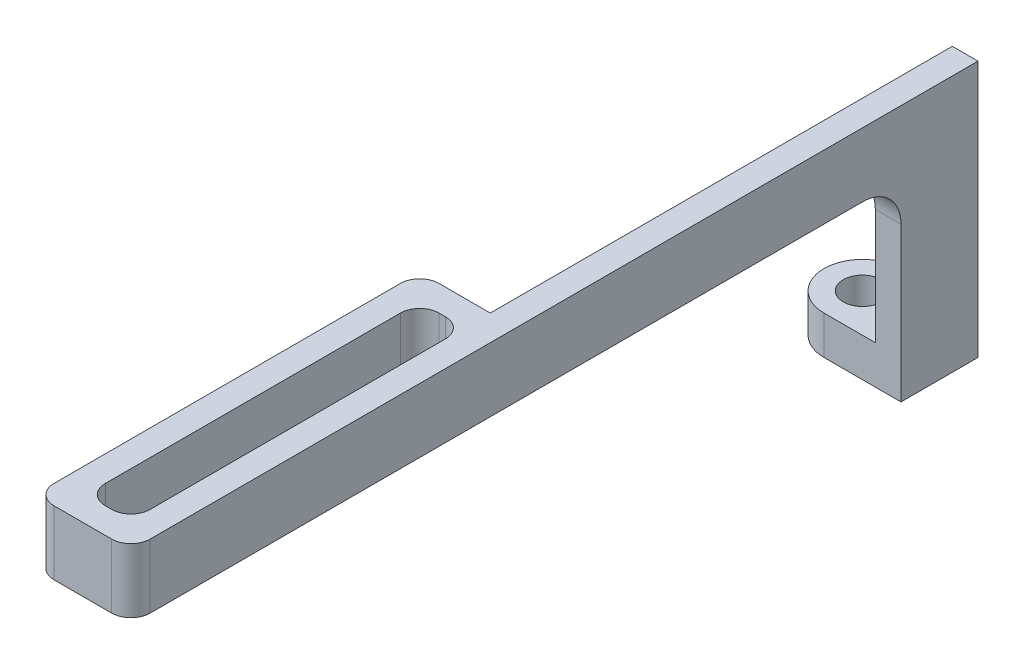
ISO-10303-21;
HEADER;
FILE_DESCRIPTION(('STEP AP214'),'2;1');
FILE_NAME('part.step','',(''),(''),'','','');
FILE_SCHEMA(('AUTOMOTIVE_DESIGN { 1 0 10303 214 1 1 1 1 }'));
ENDSEC;
DATA;
#1=APPLICATION_CONTEXT('core data for automotive mechanical design processes');
#2=APPLICATION_PROTOCOL_DEFINITION('international standard','automotive_design',2000,#1);
#3=PRODUCT_CONTEXT('',#1,'mechanical');
#4=PRODUCT('Part','Part','',(#3));
#5=PRODUCT_RELATED_PRODUCT_CATEGORY('part','',(#4));
#6=PRODUCT_DEFINITION_FORMATION('','',#4);
#7=PRODUCT_DEFINITION_CONTEXT('part definition',#1,'design');
#8=PRODUCT_DEFINITION('design','',#6,#7);
#9=PRODUCT_DEFINITION_SHAPE('','',#8);
#10=(LENGTH_UNIT() NAMED_UNIT(*) SI_UNIT(.MILLI.,.METRE.));
#11=(NAMED_UNIT(*) PLANE_ANGLE_UNIT() SI_UNIT($,.RADIAN.));
#12=(NAMED_UNIT(*) SI_UNIT($,.STERADIAN.) SOLID_ANGLE_UNIT());
#13=UNCERTAINTY_MEASURE_WITH_UNIT(LENGTH_MEASURE(1.E-05),#10,'distance_accuracy_value','');
#14=(GEOMETRIC_REPRESENTATION_CONTEXT(3) GLOBAL_UNCERTAINTY_ASSIGNED_CONTEXT((#13)) GLOBAL_UNIT_ASSIGNED_CONTEXT((#10,
#11,#12)) REPRESENTATION_CONTEXT('',''));
#15=CARTESIAN_POINT('',(0.,0.,0.));
#16=DIRECTION('',(0.,0.,1.));
#17=DIRECTION('',(1.,0.,0.));
#18=AXIS2_PLACEMENT_3D('',#15,#16,#17);
#19=CARTESIAN_POINT('',(0.,3.,0.));
#20=DIRECTION('',(0.,1.,0.));
#21=DIRECTION('',(0.,0.,1.));
#22=AXIS2_PLACEMENT_3D('',#19,#20,#21);
#23=PLANE('',#22);
#24=CARTESIAN_POINT('',(0.,3.,0.));
#25=DIRECTION('',(0.,1.,0.));
#26=DIRECTION('',(0.,0.,1.));
#27=AXIS2_PLACEMENT_3D('',#24,#25,#26);
#28=CIRCLE('',#27,1.5);
#29=CARTESIAN_POINT('',(0.,3.,1.5));
#30=VERTEX_POINT('',#29);
#31=EDGE_CURVE('E282',#30,#30,#28,.T.);
#32=ORIENTED_EDGE('',*,*,#31,.F.);
#33=EDGE_LOOP('',(#32));
#34=FACE_BOUND('',#33,.T.);
#35=DIRECTION('',(-1.,0.,0.));
#36=VECTOR('',#35,1.);
#37=CARTESIAN_POINT('',(0.,3.,3.));
#38=LINE('',#37,#36);
#39=CARTESIAN_POINT('',(4.,3.,3.));
#40=VERTEX_POINT('',#39);
#41=CARTESIAN_POINT('',(0.,3.,3.));
#42=VERTEX_POINT('',#41);
#43=EDGE_CURVE('E279',#40,#42,#38,.T.);
#44=ORIENTED_EDGE('',*,*,#43,.F.);
#45=DIRECTION('',(0.,0.,-1.));
#46=VECTOR('',#45,1.);
#47=CARTESIAN_POINT('',(4.,3.,0.));
#48=LINE('',#47,#46);
#49=CARTESIAN_POINT('',(4.,3.,-3.));
#50=VERTEX_POINT('',#49);
#51=EDGE_CURVE('E268',#40,#50,#48,.T.);
#52=ORIENTED_EDGE('',*,*,#51,.T.);
#53=DIRECTION('',(1.,0.,0.));
#54=VECTOR('',#53,1.);
#55=CARTESIAN_POINT('',(0.,3.,-3.));
#56=LINE('',#55,#54);
#57=CARTESIAN_POINT('',(0.,3.,-3.));
#58=VERTEX_POINT('',#57);
#59=EDGE_CURVE('E205',#58,#50,#56,.T.);
#60=ORIENTED_EDGE('',*,*,#59,.F.);
#61=CARTESIAN_POINT('',(0.,3.,0.));
#62=DIRECTION('',(0.,1.,0.));
#63=DIRECTION('',(0.,0.,1.));
#64=AXIS2_PLACEMENT_3D('',#61,#62,#63);
#65=CIRCLE('',#64,3.);
#66=EDGE_CURVE('E274',#58,#42,#65,.T.);
#67=ORIENTED_EDGE('',*,*,#66,.T.);
#68=EDGE_LOOP('',(#44,#52,#60,#67));
#69=FACE_BOUND('',#68,.T.);
#70=ADVANCED_FACE('F47',(#34,#69),#23,.T.);
#71=CARTESIAN_POINT('',(0.,3.,-3.));
#72=DIRECTION('',(0.,0.,-1.));
#73=DIRECTION('',(-1.,0.,0.));
#74=AXIS2_PLACEMENT_3D('',#71,#72,#73);
#75=PLANE('',#74);
#76=DIRECTION('',(0.,-1.,0.));
#77=VECTOR('',#76,1.);
#78=CARTESIAN_POINT('',(6.,3.,-3.));
#79=LINE('',#78,#77);
#80=CARTESIAN_POINT('',(6.,20.,-3.));
#81=VERTEX_POINT('',#80);
#82=CARTESIAN_POINT('',(6.,0.,-3.));
#83=VERTEX_POINT('',#82);
#84=EDGE_CURVE('E286',#81,#83,#79,.T.);
#85=ORIENTED_EDGE('',*,*,#84,.T.);
#86=DIRECTION('',(1.,0.,0.));
#87=VECTOR('',#86,1.);
#88=CARTESIAN_POINT('',(0.,0.,-3.));
#89=LINE('',#88,#87);
#90=CARTESIAN_POINT('',(0.,0.,-3.));
#91=VERTEX_POINT('',#90);
#92=EDGE_CURVE('E271',#91,#83,#89,.T.);
#93=ORIENTED_EDGE('',*,*,#92,.F.);
#94=DIRECTION('',(0.,-1.,0.));
#95=VECTOR('',#94,1.);
#96=CARTESIAN_POINT('',(0.,3.,-3.));
#97=LINE('',#96,#95);
#98=EDGE_CURVE('E312',#58,#91,#97,.T.);
#99=ORIENTED_EDGE('',*,*,#98,.F.);
#100=ORIENTED_EDGE('',*,*,#59,.T.);
#101=DIRECTION('',(0.,-1.,0.));
#102=VECTOR('',#101,1.);
#103=CARTESIAN_POINT('',(4.,15.,-3.));
#104=LINE('',#103,#102);
#105=CARTESIAN_POINT('',(4.,20.,-3.));
#106=VERTEX_POINT('',#105);
#107=EDGE_CURVE('E198',#106,#50,#104,.T.);
#108=ORIENTED_EDGE('',*,*,#107,.F.);
#109=DIRECTION('',(-1.,0.,0.));
#110=VECTOR('',#109,1.);
#111=CARTESIAN_POINT('',(6.,20.,-3.));
#112=LINE('',#111,#110);
#113=EDGE_CURVE('E203',#81,#106,#112,.T.);
#114=ORIENTED_EDGE('',*,*,#113,.F.);
#115=EDGE_LOOP('',(#85,#93,#99,#100,#108,#114));
#116=FACE_BOUND('',#115,.T.);
#117=ADVANCED_FACE('F201',(#116),#75,.T.);
#118=CARTESIAN_POINT('',(0.,3.,0.));
#119=DIRECTION('',(0.,-1.,0.));
#120=DIRECTION('',(0.,0.,-1.));
#121=AXIS2_PLACEMENT_3D('',#118,#119,#120);
#122=CYLINDRICAL_SURFACE('',#121,3.);
#123=CARTESIAN_POINT('',(0.,0.,0.));
#124=DIRECTION('',(0.,1.,0.));
#125=DIRECTION('',(0.,0.,1.));
#126=AXIS2_PLACEMENT_3D('',#123,#124,#125);
#127=CIRCLE('',#126,3.);
#128=CARTESIAN_POINT('',(0.,0.,3.));
#129=VERTEX_POINT('',#128);
#130=EDGE_CURVE('E289',#91,#129,#127,.T.);
#131=ORIENTED_EDGE('',*,*,#130,.T.);
#132=DIRECTION('',(0.,-1.,0.));
#133=VECTOR('',#132,1.);
#134=CARTESIAN_POINT('',(0.,3.,3.));
#135=LINE('',#134,#133);
#136=EDGE_CURVE('E308',#42,#129,#135,.T.);
#137=ORIENTED_EDGE('',*,*,#136,.F.);
#138=ORIENTED_EDGE('',*,*,#66,.F.);
#139=ORIENTED_EDGE('',*,*,#98,.T.);
#140=EDGE_LOOP('',(#131,#137,#138,#139));
#141=FACE_BOUND('',#140,.T.);
#142=ADVANCED_FACE('F480',(#141),#122,.T.);
#143=CARTESIAN_POINT('',(0.,3.,3.));
#144=DIRECTION('',(0.,0.,1.));
#145=DIRECTION('',(1.,0.,0.));
#146=AXIS2_PLACEMENT_3D('',#143,#144,#145);
#147=PLANE('',#146);
#148=DIRECTION('',(0.,-1.,0.));
#149=VECTOR('',#148,1.);
#150=CARTESIAN_POINT('',(6.,3.,3.));
#151=LINE('',#150,#149);
#152=CARTESIAN_POINT('',(6.,12.,3.));
#153=VERTEX_POINT('',#152);
#154=CARTESIAN_POINT('',(6.,0.,3.));
#155=VERTEX_POINT('',#154);
#156=EDGE_CURVE('E305',#153,#155,#151,.T.);
#157=ORIENTED_EDGE('',*,*,#156,.F.);
#158=DIRECTION('',(1.,0.,0.));
#159=VECTOR('',#158,1.);
#160=CARTESIAN_POINT('',(0.,12.,3.));
#161=LINE('',#160,#159);
#162=CARTESIAN_POINT('',(4.,12.,3.));
#163=VERTEX_POINT('',#162);
#164=EDGE_CURVE('E319',#153,#163,#161,.F.);
#165=ORIENTED_EDGE('',*,*,#164,.T.);
#166=DIRECTION('',(0.,-1.,0.));
#167=VECTOR('',#166,1.);
#168=CARTESIAN_POINT('',(4.,15.,3.));
#169=LINE('',#168,#167);
#170=EDGE_CURVE('E210',#163,#40,#169,.T.);
#171=ORIENTED_EDGE('',*,*,#170,.T.);
#172=ORIENTED_EDGE('',*,*,#43,.T.);
#173=ORIENTED_EDGE('',*,*,#136,.T.);
#174=DIRECTION('',(-1.,0.,0.));
#175=VECTOR('',#174,1.);
#176=CARTESIAN_POINT('',(0.,0.,3.));
#177=LINE('',#176,#175);
#178=EDGE_CURVE('E293',#155,#129,#177,.T.);
#179=ORIENTED_EDGE('',*,*,#178,.F.);
#180=EDGE_LOOP('',(#157,#165,#171,#172,#173,#179));
#181=FACE_BOUND('',#180,.T.);
#182=ADVANCED_FACE('F496',(#181),#147,.T.);
#183=CARTESIAN_POINT('',(6.,3.,0.));
#184=DIRECTION('',(1.,0.,0.));
#185=DIRECTION('',(0.,0.,-1.));
#186=AXIS2_PLACEMENT_3D('',#183,#184,#185);
#187=PLANE('',#186);
#188=DIRECTION('',(0.,0.,-1.));
#189=VECTOR('',#188,1.);
#190=CARTESIAN_POINT('',(6.,20.,-3.));
#191=LINE('',#190,#189);
#192=CARTESIAN_POINT('',(6.00000000000001,20.,61.5));
#193=VERTEX_POINT('',#192);
#194=EDGE_CURVE('E225',#193,#81,#191,.T.);
#195=ORIENTED_EDGE('',*,*,#194,.F.);
#196=DIRECTION('',(0.,-1.,0.));
#197=VECTOR('',#196,1.);
#198=CARTESIAN_POINT('',(6.,15.,61.5));
#199=LINE('',#198,#197);
#200=CARTESIAN_POINT('',(6.00000000000001,15.,61.5));
#201=VERTEX_POINT('',#200);
#202=EDGE_CURVE('E363',#193,#201,#199,.T.);
#203=ORIENTED_EDGE('',*,*,#202,.T.);
#204=DIRECTION('',(0.,0.,-1.));
#205=VECTOR('',#204,1.);
#206=CARTESIAN_POINT('',(6.,15.,-3.));
#207=LINE('',#206,#205);
#208=CARTESIAN_POINT('',(6.,15.,6.));
#209=VERTEX_POINT('',#208);
#210=EDGE_CURVE('E228',#201,#209,#207,.T.);
#211=ORIENTED_EDGE('',*,*,#210,.T.);
#212=CARTESIAN_POINT('',(6.,12.,6.));
#213=DIRECTION('',(1.,0.,0.));
#214=DIRECTION('',(0.,0.,-1.));
#215=AXIS2_PLACEMENT_3D('',#212,#213,#214);
#216=CIRCLE('',#215,3.);
#217=EDGE_CURVE('E322',#209,#153,#216,.F.);
#218=ORIENTED_EDGE('',*,*,#217,.T.);
#219=ORIENTED_EDGE('',*,*,#156,.T.);
#220=DIRECTION('',(0.,0.,1.));
#221=VECTOR('',#220,1.);
#222=CARTESIAN_POINT('',(6.,0.,0.));
#223=LINE('',#222,#221);
#224=EDGE_CURVE('E296',#83,#155,#223,.T.);
#225=ORIENTED_EDGE('',*,*,#224,.F.);
#226=ORIENTED_EDGE('',*,*,#84,.F.);
#227=EDGE_LOOP('',(#195,#203,#211,#218,#219,#225,#226));
#228=FACE_BOUND('',#227,.T.);
#229=ADVANCED_FACE('F492',(#228),#187,.T.);
#230=CARTESIAN_POINT('',(0.,3.,0.));
#231=DIRECTION('',(0.,-1.,0.));
#232=DIRECTION('',(0.,0.,-1.));
#233=AXIS2_PLACEMENT_3D('',#230,#231,#232);
#234=CYLINDRICAL_SURFACE('',#233,1.5);
#235=ORIENTED_EDGE('',*,*,#31,.T.);
#236=EDGE_LOOP('',(#235));
#237=FACE_BOUND('',#236,.T.);
#238=CARTESIAN_POINT('',(0.,0.,0.));
#239=DIRECTION('',(0.,1.,0.));
#240=DIRECTION('',(0.,0.,1.));
#241=AXIS2_PLACEMENT_3D('',#238,#239,#240);
#242=CIRCLE('',#241,1.5);
#243=CARTESIAN_POINT('',(0.,0.,1.5));
#244=VERTEX_POINT('',#243);
#245=EDGE_CURVE('E275',#244,#244,#242,.T.);
#246=ORIENTED_EDGE('',*,*,#245,.F.);
#247=EDGE_LOOP('',(#246));
#248=FACE_BOUND('',#247,.T.);
#249=ADVANCED_FACE('F489',(#237,#248),#234,.F.);
#250=CARTESIAN_POINT('',(0.,0.,0.));
#251=DIRECTION('',(0.,1.,0.));
#252=DIRECTION('',(0.,0.,1.));
#253=AXIS2_PLACEMENT_3D('',#250,#251,#252);
#254=PLANE('',#253);
#255=ORIENTED_EDGE('',*,*,#178,.T.);
#256=ORIENTED_EDGE('',*,*,#130,.F.);
#257=ORIENTED_EDGE('',*,*,#92,.T.);
#258=ORIENTED_EDGE('',*,*,#224,.T.);
#259=EDGE_LOOP('',(#255,#256,#257,#258));
#260=FACE_BOUND('',#259,.T.);
#261=ORIENTED_EDGE('',*,*,#245,.T.);
#262=EDGE_LOOP('',(#261));
#263=FACE_BOUND('',#262,.T.);
#264=ADVANCED_FACE('F487',(#260,#263),#254,.F.);
#265=CARTESIAN_POINT('',(4.,15.,3.));
#266=DIRECTION('',(1.,0.,0.));
#267=DIRECTION('',(0.,0.,-1.));
#268=AXIS2_PLACEMENT_3D('',#265,#266,#267);
#269=PLANE('',#268);
#270=ORIENTED_EDGE('',*,*,#51,.F.);
#271=ORIENTED_EDGE('',*,*,#170,.F.);
#272=CARTESIAN_POINT('',(4.,12.,6.));
#273=DIRECTION('',(1.,0.,0.));
#274=DIRECTION('',(0.,0.,-1.));
#275=AXIS2_PLACEMENT_3D('',#272,#273,#274);
#276=CIRCLE('',#275,3.);
#277=CARTESIAN_POINT('',(4.,15.,6.));
#278=VERTEX_POINT('',#277);
#279=EDGE_CURVE('E325',#163,#278,#276,.T.);
#280=ORIENTED_EDGE('',*,*,#279,.T.);
#281=DIRECTION('',(0.,0.,1.));
#282=VECTOR('',#281,1.);
#283=CARTESIAN_POINT('',(4.,15.,-3.));
#284=LINE('',#283,#282);
#285=CARTESIAN_POINT('',(4.,15.,33.));
#286=VERTEX_POINT('',#285);
#287=EDGE_CURVE('E249',#278,#286,#284,.T.);
#288=ORIENTED_EDGE('',*,*,#287,.T.);
#289=DIRECTION('',(0.,-1.,0.));
#290=VECTOR('',#289,1.);
#291=CARTESIAN_POINT('',(4.,20.,33.));
#292=LINE('',#291,#290);
#293=CARTESIAN_POINT('',(4.,20.,33.));
#294=VERTEX_POINT('',#293);
#295=EDGE_CURVE('E211',#294,#286,#292,.T.);
#296=ORIENTED_EDGE('',*,*,#295,.F.);
#297=DIRECTION('',(0.,0.,1.));
#298=VECTOR('',#297,1.);
#299=CARTESIAN_POINT('',(4.,20.,-3.));
#300=LINE('',#299,#298);
#301=EDGE_CURVE('E214',#106,#294,#300,.T.);
#302=ORIENTED_EDGE('',*,*,#301,.F.);
#303=ORIENTED_EDGE('',*,*,#107,.T.);
#304=EDGE_LOOP('',(#270,#271,#280,#288,#296,#302,#303));
#305=FACE_BOUND('',#304,.T.);
#306=ADVANCED_FACE('F215',(#305),#269,.F.);
#307=CARTESIAN_POINT('',(0.,15.,0.));
#308=DIRECTION('',(0.,1.,0.));
#309=DIRECTION('',(0.,0.,1.));
#310=AXIS2_PLACEMENT_3D('',#307,#308,#309);
#311=PLANE('',#310);
#312=DIRECTION('',(1.,0.,0.));
#313=VECTOR('',#312,1.);
#314=CARTESIAN_POINT('',(0.500000000000008,15.,61.));
#315=LINE('',#314,#313);
#316=CARTESIAN_POINT('',(2.00000000000001,15.,61.));
#317=VERTEX_POINT('',#316);
#318=CARTESIAN_POINT('',(2.50000000000001,15.,61.));
#319=VERTEX_POINT('',#318);
#320=EDGE_CURVE('E234',#317,#319,#315,.T.);
#321=ORIENTED_EDGE('',*,*,#320,.T.);
#322=CARTESIAN_POINT('',(2.50000000000001,15.,59.5));
#323=DIRECTION('',(0.,1.,0.));
#324=DIRECTION('',(0.,0.,1.));
#325=AXIS2_PLACEMENT_3D('',#322,#323,#324);
#326=CIRCLE('',#325,1.5);
#327=CARTESIAN_POINT('',(4.00000000000001,15.,59.5));
#328=VERTEX_POINT('',#327);
#329=EDGE_CURVE('E394',#319,#328,#326,.T.);
#330=ORIENTED_EDGE('',*,*,#329,.T.);
#331=DIRECTION('',(0.,0.,-1.));
#332=VECTOR('',#331,1.);
#333=CARTESIAN_POINT('',(4.,15.,35.));
#334=LINE('',#333,#332);
#335=CARTESIAN_POINT('',(4.,15.,36.5));
#336=VERTEX_POINT('',#335);
#337=EDGE_CURVE('E446',#328,#336,#334,.T.);
#338=ORIENTED_EDGE('',*,*,#337,.T.);
#339=CARTESIAN_POINT('',(2.5,15.,36.5));
#340=DIRECTION('',(0.,1.,0.));
#341=DIRECTION('',(0.,0.,1.));
#342=AXIS2_PLACEMENT_3D('',#339,#340,#341);
#343=CIRCLE('',#342,1.5);
#344=CARTESIAN_POINT('',(2.5,15.,35.));
#345=VERTEX_POINT('',#344);
#346=EDGE_CURVE('E405',#336,#345,#343,.T.);
#347=ORIENTED_EDGE('',*,*,#346,.T.);
#348=DIRECTION('',(-1.,0.,0.));
#349=VECTOR('',#348,1.);
#350=CARTESIAN_POINT('',(4.,15.,35.));
#351=LINE('',#350,#349);
#352=CARTESIAN_POINT('',(2.,15.,35.));
#353=VERTEX_POINT('',#352);
#354=EDGE_CURVE('E419',#345,#353,#351,.T.);
#355=ORIENTED_EDGE('',*,*,#354,.T.);
#356=CARTESIAN_POINT('',(2.,15.,36.5));
#357=DIRECTION('',(0.,1.,0.));
#358=DIRECTION('',(0.,0.,1.));
#359=AXIS2_PLACEMENT_3D('',#356,#357,#358);
#360=CIRCLE('',#359,1.5);
#361=CARTESIAN_POINT('',(0.500000000000005,15.,36.5));
#362=VERTEX_POINT('',#361);
#363=EDGE_CURVE('E56',#353,#362,#360,.T.);
#364=ORIENTED_EDGE('',*,*,#363,.T.);
#365=DIRECTION('',(0.,0.,1.));
#366=VECTOR('',#365,1.);
#367=CARTESIAN_POINT('',(0.500000000000004,15.,35.));
#368=LINE('',#367,#366);
#369=CARTESIAN_POINT('',(0.500000000000007,15.,59.5));
#370=VERTEX_POINT('',#369);
#371=EDGE_CURVE('E417',#362,#370,#368,.T.);
#372=ORIENTED_EDGE('',*,*,#371,.T.);
#373=CARTESIAN_POINT('',(2.00000000000001,15.,59.5));
#374=DIRECTION('',(0.,1.,0.));
#375=DIRECTION('',(0.,0.,1.));
#376=AXIS2_PLACEMENT_3D('',#373,#374,#375);
#377=CIRCLE('',#376,1.5);
#378=EDGE_CURVE('E400',#370,#317,#377,.T.);
#379=ORIENTED_EDGE('',*,*,#378,.T.);
#380=EDGE_LOOP('',(#321,#330,#338,#347,#355,#364,#372,#379));
#381=FACE_BOUND('',#380,.T.);
#382=DIRECTION('',(0.,0.,1.));
#383=VECTOR('',#382,1.);
#384=CARTESIAN_POINT('',(-1.5,15.,33.));
#385=LINE('',#384,#383);
#386=CARTESIAN_POINT('',(-1.5,15.,34.5));
#387=VERTEX_POINT('',#386);
#388=CARTESIAN_POINT('',(-1.49999999999999,15.,61.5));
#389=VERTEX_POINT('',#388);
#390=EDGE_CURVE('E257',#387,#389,#385,.T.);
#391=ORIENTED_EDGE('',*,*,#390,.F.);
#392=CARTESIAN_POINT('',(0.,15.,34.5));
#393=DIRECTION('',(0.,1.,0.));
#394=DIRECTION('',(0.,0.,1.));
#395=AXIS2_PLACEMENT_3D('',#392,#393,#394);
#396=CIRCLE('',#395,1.5);
#397=CARTESIAN_POINT('',(0.,15.,33.));
#398=VERTEX_POINT('',#397);
#399=EDGE_CURVE('E341',#387,#398,#396,.F.);
#400=ORIENTED_EDGE('',*,*,#399,.T.);
#401=DIRECTION('',(-1.,0.,0.));
#402=VECTOR('',#401,1.);
#403=CARTESIAN_POINT('',(4.,15.,33.));
#404=LINE('',#403,#402);
#405=EDGE_CURVE('E252',#286,#398,#404,.T.);
#406=ORIENTED_EDGE('',*,*,#405,.F.);
#407=ORIENTED_EDGE('',*,*,#287,.F.);
#408=DIRECTION('',(1.,0.,0.));
#409=VECTOR('',#408,1.);
#410=CARTESIAN_POINT('',(0.,15.,6.));
#411=LINE('',#410,#409);
#412=EDGE_CURVE('E315',#278,#209,#411,.T.);
#413=ORIENTED_EDGE('',*,*,#412,.T.);
#414=ORIENTED_EDGE('',*,*,#210,.F.);
#415=CARTESIAN_POINT('',(4.5,15.,61.5));
#416=DIRECTION('',(0.,1.,0.));
#417=DIRECTION('',(0.,0.,1.));
#418=AXIS2_PLACEMENT_3D('',#415,#416,#417);
#419=CIRCLE('',#418,1.5);
#420=CARTESIAN_POINT('',(4.5,15.,63.));
#421=VERTEX_POINT('',#420);
#422=EDGE_CURVE('E335',#201,#421,#419,.F.);
#423=ORIENTED_EDGE('',*,*,#422,.T.);
#424=DIRECTION('',(1.,0.,0.));
#425=VECTOR('',#424,1.);
#426=CARTESIAN_POINT('',(4.00000000000001,15.,63.));
#427=LINE('',#426,#425);
#428=CARTESIAN_POINT('',(0.,15.,63.));
#429=VERTEX_POINT('',#428);
#430=EDGE_CURVE('E231',#429,#421,#427,.T.);
#431=ORIENTED_EDGE('',*,*,#430,.F.);
#432=CARTESIAN_POINT('',(0.,15.,61.5));
#433=DIRECTION('',(0.,1.,0.));
#434=DIRECTION('',(0.,0.,1.));
#435=AXIS2_PLACEMENT_3D('',#432,#433,#434);
#436=CIRCLE('',#435,1.5);
#437=EDGE_CURVE('E338',#429,#389,#436,.F.);
#438=ORIENTED_EDGE('',*,*,#437,.T.);
#439=EDGE_LOOP('',(#391,#400,#406,#407,#413,#414,#423,#431,#438));
#440=FACE_BOUND('',#439,.T.);
#441=ADVANCED_FACE('F415',(#381,#440),#311,.F.);
#442=CARTESIAN_POINT('',(0.,20.,0.));
#443=DIRECTION('',(0.,1.,0.));
#444=DIRECTION('',(0.,0.,1.));
#445=AXIS2_PLACEMENT_3D('',#442,#443,#444);
#446=PLANE('',#445);
#447=DIRECTION('',(-1.,0.,0.));
#448=VECTOR('',#447,1.);
#449=CARTESIAN_POINT('',(4.,20.,33.));
#450=LINE('',#449,#448);
#451=CARTESIAN_POINT('',(0.,20.,33.));
#452=VERTEX_POINT('',#451);
#453=EDGE_CURVE('E221',#294,#452,#450,.T.);
#454=ORIENTED_EDGE('',*,*,#453,.T.);
#455=CARTESIAN_POINT('',(0.,20.,34.5));
#456=DIRECTION('',(0.,1.,0.));
#457=DIRECTION('',(0.,0.,1.));
#458=AXIS2_PLACEMENT_3D('',#455,#456,#457);
#459=CIRCLE('',#458,1.5);
#460=CARTESIAN_POINT('',(-1.5,20.,34.5));
#461=VERTEX_POINT('',#460);
#462=EDGE_CURVE('E353',#452,#461,#459,.T.);
#463=ORIENTED_EDGE('',*,*,#462,.T.);
#464=DIRECTION('',(0.,0.,1.));
#465=VECTOR('',#464,1.);
#466=CARTESIAN_POINT('',(-1.5,20.,33.));
#467=LINE('',#466,#465);
#468=CARTESIAN_POINT('',(-1.49999999999999,20.,61.5));
#469=VERTEX_POINT('',#468);
#470=EDGE_CURVE('E239',#461,#469,#467,.T.);
#471=ORIENTED_EDGE('',*,*,#470,.T.);
#472=CARTESIAN_POINT('',(0.,20.,61.5));
#473=DIRECTION('',(0.,1.,0.));
#474=DIRECTION('',(0.,0.,1.));
#475=AXIS2_PLACEMENT_3D('',#472,#473,#474);
#476=CIRCLE('',#475,1.5);
#477=CARTESIAN_POINT('',(0.,20.,63.));
#478=VERTEX_POINT('',#477);
#479=EDGE_CURVE('E350',#469,#478,#476,.T.);
#480=ORIENTED_EDGE('',*,*,#479,.T.);
#481=DIRECTION('',(1.,0.,0.));
#482=VECTOR('',#481,1.);
#483=CARTESIAN_POINT('',(-1.49999999999999,20.,63.));
#484=LINE('',#483,#482);
#485=CARTESIAN_POINT('',(4.5,20.,63.));
#486=VERTEX_POINT('',#485);
#487=EDGE_CURVE('E243',#478,#486,#484,.T.);
#488=ORIENTED_EDGE('',*,*,#487,.T.);
#489=CARTESIAN_POINT('',(4.5,20.,61.5));
#490=DIRECTION('',(0.,1.,0.));
#491=DIRECTION('',(0.,0.,1.));
#492=AXIS2_PLACEMENT_3D('',#489,#490,#491);
#493=CIRCLE('',#492,1.5);
#494=EDGE_CURVE('E347',#486,#193,#493,.T.);
#495=ORIENTED_EDGE('',*,*,#494,.T.);
#496=ORIENTED_EDGE('',*,*,#194,.T.);
#497=ORIENTED_EDGE('',*,*,#113,.T.);
#498=ORIENTED_EDGE('',*,*,#301,.T.);
#499=EDGE_LOOP('',(#454,#463,#471,#480,#488,#495,#496,#497,#498));
#500=FACE_BOUND('',#499,.T.);
#501=DIRECTION('',(-1.,0.,0.));
#502=VECTOR('',#501,1.);
#503=CARTESIAN_POINT('',(4.,20.,35.));
#504=LINE('',#503,#502);
#505=CARTESIAN_POINT('',(2.5,20.,35.));
#506=VERTEX_POINT('',#505);
#507=CARTESIAN_POINT('',(2.,20.,35.));
#508=VERTEX_POINT('',#507);
#509=EDGE_CURVE('E428',#506,#508,#504,.T.);
#510=ORIENTED_EDGE('',*,*,#509,.F.);
#511=CARTESIAN_POINT('',(2.5,20.,36.5));
#512=DIRECTION('',(0.,1.,0.));
#513=DIRECTION('',(0.,0.,1.));
#514=AXIS2_PLACEMENT_3D('',#511,#512,#513);
#515=CIRCLE('',#514,1.5);
#516=CARTESIAN_POINT('',(4.,20.,36.5));
#517=VERTEX_POINT('',#516);
#518=EDGE_CURVE('E408',#506,#517,#515,.F.);
#519=ORIENTED_EDGE('',*,*,#518,.T.);
#520=DIRECTION('',(0.,0.,-1.));
#521=VECTOR('',#520,1.);
#522=CARTESIAN_POINT('',(4.,20.,35.));
#523=LINE('',#522,#521);
#524=CARTESIAN_POINT('',(4.00000000000001,20.,59.5));
#525=VERTEX_POINT('',#524);
#526=EDGE_CURVE('E435',#525,#517,#523,.T.);
#527=ORIENTED_EDGE('',*,*,#526,.F.);
#528=CARTESIAN_POINT('',(2.50000000000001,20.,59.5));
#529=DIRECTION('',(0.,1.,0.));
#530=DIRECTION('',(0.,0.,1.));
#531=AXIS2_PLACEMENT_3D('',#528,#529,#530);
#532=CIRCLE('',#531,1.5);
#533=CARTESIAN_POINT('',(2.50000000000001,20.,61.));
#534=VERTEX_POINT('',#533);
#535=EDGE_CURVE('E397',#525,#534,#532,.F.);
#536=ORIENTED_EDGE('',*,*,#535,.T.);
#537=DIRECTION('',(1.,0.,0.));
#538=VECTOR('',#537,1.);
#539=CARTESIAN_POINT('',(0.500000000000008,20.,61.));
#540=LINE('',#539,#538);
#541=CARTESIAN_POINT('',(2.00000000000001,20.,61.));
#542=VERTEX_POINT('',#541);
#543=EDGE_CURVE('E253',#542,#534,#540,.T.);
#544=ORIENTED_EDGE('',*,*,#543,.F.);
#545=CARTESIAN_POINT('',(2.00000000000001,20.,59.5));
#546=DIRECTION('',(0.,1.,0.));
#547=DIRECTION('',(0.,0.,1.));
#548=AXIS2_PLACEMENT_3D('',#545,#546,#547);
#549=CIRCLE('',#548,1.5);
#550=CARTESIAN_POINT('',(0.500000000000007,20.,59.5));
#551=VERTEX_POINT('',#550);
#552=EDGE_CURVE('E63',#542,#551,#549,.F.);
#553=ORIENTED_EDGE('',*,*,#552,.T.);
#554=DIRECTION('',(0.,0.,1.));
#555=VECTOR('',#554,1.);
#556=CARTESIAN_POINT('',(0.500000000000004,20.,35.));
#557=LINE('',#556,#555);
#558=CARTESIAN_POINT('',(0.500000000000005,20.,36.5));
#559=VERTEX_POINT('',#558);
#560=EDGE_CURVE('E430',#559,#551,#557,.T.);
#561=ORIENTED_EDGE('',*,*,#560,.F.);
#562=CARTESIAN_POINT('',(2.,20.,36.5));
#563=DIRECTION('',(0.,1.,0.));
#564=DIRECTION('',(0.,0.,1.));
#565=AXIS2_PLACEMENT_3D('',#562,#563,#564);
#566=CIRCLE('',#565,1.5);
#567=EDGE_CURVE('E11',#559,#508,#566,.F.);
#568=ORIENTED_EDGE('',*,*,#567,.T.);
#569=EDGE_LOOP('',(#510,#519,#527,#536,#544,#553,#561,#568));
#570=FACE_BOUND('',#569,.T.);
#571=ADVANCED_FACE('F223',(#500,#570),#446,.T.);
#572=CARTESIAN_POINT('',(4.,20.,33.));
#573=DIRECTION('',(0.,0.,1.));
#574=DIRECTION('',(1.,0.,0.));
#575=AXIS2_PLACEMENT_3D('',#572,#573,#574);
#576=PLANE('',#575);
#577=ORIENTED_EDGE('',*,*,#405,.T.);
#578=DIRECTION('',(0.,-1.,0.));
#579=VECTOR('',#578,1.);
#580=CARTESIAN_POINT('',(0.,20.,33.));
#581=LINE('',#580,#579);
#582=EDGE_CURVE('E344',#398,#452,#581,.F.);
#583=ORIENTED_EDGE('',*,*,#582,.T.);
#584=ORIENTED_EDGE('',*,*,#453,.F.);
#585=ORIENTED_EDGE('',*,*,#295,.T.);
#586=EDGE_LOOP('',(#577,#583,#584,#585));
#587=FACE_BOUND('',#586,.T.);
#588=ADVANCED_FACE('F542',(#587),#576,.F.);
#589=CARTESIAN_POINT('',(-1.5,20.,33.));
#590=DIRECTION('',(1.,0.,0.));
#591=DIRECTION('',(0.,0.,-1.));
#592=AXIS2_PLACEMENT_3D('',#589,#590,#591);
#593=PLANE('',#592);
#594=ORIENTED_EDGE('',*,*,#470,.F.);
#595=DIRECTION('',(0.,-1.,0.));
#596=VECTOR('',#595,1.);
#597=CARTESIAN_POINT('',(-1.5,20.,34.5));
#598=LINE('',#597,#596);
#599=EDGE_CURVE('E331',#461,#387,#598,.T.);
#600=ORIENTED_EDGE('',*,*,#599,.T.);
#601=ORIENTED_EDGE('',*,*,#390,.T.);
#602=DIRECTION('',(0.,-1.,0.));
#603=VECTOR('',#602,1.);
#604=CARTESIAN_POINT('',(-1.49999999999999,20.,61.5));
#605=LINE('',#604,#603);
#606=EDGE_CURVE('E328',#389,#469,#605,.F.);
#607=ORIENTED_EDGE('',*,*,#606,.T.);
#608=EDGE_LOOP('',(#594,#600,#601,#607));
#609=FACE_BOUND('',#608,.T.);
#610=ADVANCED_FACE('F548',(#609),#593,.F.);
#611=CARTESIAN_POINT('',(4.00000000000001,20.,63.));
#612=DIRECTION('',(0.,0.,-1.));
#613=DIRECTION('',(-1.,0.,0.));
#614=AXIS2_PLACEMENT_3D('',#611,#612,#613);
#615=PLANE('',#614);
#616=ORIENTED_EDGE('',*,*,#487,.F.);
#617=DIRECTION('',(0.,-1.,0.));
#618=VECTOR('',#617,1.);
#619=CARTESIAN_POINT('',(0.,20.,63.));
#620=LINE('',#619,#618);
#621=EDGE_CURVE('E359',#478,#429,#620,.T.);
#622=ORIENTED_EDGE('',*,*,#621,.T.);
#623=ORIENTED_EDGE('',*,*,#430,.T.);
#624=DIRECTION('',(0.,-1.,0.));
#625=VECTOR('',#624,1.);
#626=CARTESIAN_POINT('',(4.5,20.,63.));
#627=LINE('',#626,#625);
#628=EDGE_CURVE('E356',#421,#486,#627,.F.);
#629=ORIENTED_EDGE('',*,*,#628,.T.);
#630=EDGE_LOOP('',(#616,#622,#623,#629));
#631=FACE_BOUND('',#630,.T.);
#632=ADVANCED_FACE('F554',(#631),#615,.F.);
#633=CARTESIAN_POINT('',(4.,20.,35.));
#634=DIRECTION('',(-1.,0.,0.));
#635=DIRECTION('',(0.,0.,1.));
#636=AXIS2_PLACEMENT_3D('',#633,#634,#635);
#637=PLANE('',#636);
#638=ORIENTED_EDGE('',*,*,#337,.F.);
#639=DIRECTION('',(0.,-1.,0.));
#640=VECTOR('',#639,1.);
#641=CARTESIAN_POINT('',(4.00000000000001,20.,59.5));
#642=LINE('',#641,#640);
#643=EDGE_CURVE('E378',#328,#525,#642,.F.);
#644=ORIENTED_EDGE('',*,*,#643,.T.);
#645=ORIENTED_EDGE('',*,*,#526,.T.);
#646=DIRECTION('',(0.,-1.,0.));
#647=VECTOR('',#646,1.);
#648=CARTESIAN_POINT('',(4.,15.,36.5));
#649=LINE('',#648,#647);
#650=EDGE_CURVE('E374',#517,#336,#649,.T.);
#651=ORIENTED_EDGE('',*,*,#650,.T.);
#652=EDGE_LOOP('',(#638,#644,#645,#651));
#653=FACE_BOUND('',#652,.T.);
#654=ADVANCED_FACE('F556',(#653),#637,.T.);
#655=CARTESIAN_POINT('',(4.,20.,35.));
#656=DIRECTION('',(0.,0.,1.));
#657=DIRECTION('',(1.,0.,0.));
#658=AXIS2_PLACEMENT_3D('',#655,#656,#657);
#659=PLANE('',#658);
#660=ORIENTED_EDGE('',*,*,#354,.F.);
#661=DIRECTION('',(0.,-1.,0.));
#662=VECTOR('',#661,1.);
#663=CARTESIAN_POINT('',(2.5,20.,35.));
#664=LINE('',#663,#662);
#665=EDGE_CURVE('E391',#345,#506,#664,.F.);
#666=ORIENTED_EDGE('',*,*,#665,.T.);
#667=ORIENTED_EDGE('',*,*,#509,.T.);
#668=DIRECTION('',(0.,-1.,0.));
#669=VECTOR('',#668,1.);
#670=CARTESIAN_POINT('',(2.,15.,35.));
#671=LINE('',#670,#669);
#672=EDGE_CURVE('E387',#508,#353,#671,.T.);
#673=ORIENTED_EDGE('',*,*,#672,.T.);
#674=EDGE_LOOP('',(#660,#666,#667,#673));
#675=FACE_BOUND('',#674,.T.);
#676=ADVANCED_FACE('F432',(#675),#659,.T.);
#677=CARTESIAN_POINT('',(0.500000000000004,20.,35.));
#678=DIRECTION('',(1.,0.,0.));
#679=DIRECTION('',(0.,0.,-1.));
#680=AXIS2_PLACEMENT_3D('',#677,#678,#679);
#681=PLANE('',#680);
#682=ORIENTED_EDGE('',*,*,#560,.T.);
#683=DIRECTION('',(0.,-1.,0.));
#684=VECTOR('',#683,1.);
#685=CARTESIAN_POINT('',(0.500000000000007,15.,59.5));
#686=LINE('',#685,#684);
#687=EDGE_CURVE('E383',#551,#370,#686,.T.);
#688=ORIENTED_EDGE('',*,*,#687,.T.);
#689=ORIENTED_EDGE('',*,*,#371,.F.);
#690=DIRECTION('',(0.,-1.,0.));
#691=VECTOR('',#690,1.);
#692=CARTESIAN_POINT('',(0.500000000000005,20.,36.5));
#693=LINE('',#692,#691);
#694=EDGE_CURVE('E70',#362,#559,#693,.F.);
#695=ORIENTED_EDGE('',*,*,#694,.T.);
#696=EDGE_LOOP('',(#682,#688,#689,#695));
#697=FACE_BOUND('',#696,.T.);
#698=ADVANCED_FACE('F422',(#697),#681,.T.);
#699=CARTESIAN_POINT('',(0.500000000000008,20.,61.));
#700=DIRECTION('',(0.,0.,-1.));
#701=DIRECTION('',(-1.,0.,0.));
#702=AXIS2_PLACEMENT_3D('',#699,#700,#701);
#703=PLANE('',#702);
#704=ORIENTED_EDGE('',*,*,#543,.T.);
#705=DIRECTION('',(0.,-1.,0.));
#706=VECTOR('',#705,1.);
#707=CARTESIAN_POINT('',(2.50000000000001,15.,61.));
#708=LINE('',#707,#706);
#709=EDGE_CURVE('E370',#534,#319,#708,.T.);
#710=ORIENTED_EDGE('',*,*,#709,.T.);
#711=ORIENTED_EDGE('',*,*,#320,.F.);
#712=DIRECTION('',(0.,-1.,0.));
#713=VECTOR('',#712,1.);
#714=CARTESIAN_POINT('',(2.00000000000001,20.,61.));
#715=LINE('',#714,#713);
#716=EDGE_CURVE('E367',#317,#542,#715,.F.);
#717=ORIENTED_EDGE('',*,*,#716,.T.);
#718=EDGE_LOOP('',(#704,#710,#711,#717));
#719=FACE_BOUND('',#718,.T.);
#720=ADVANCED_FACE('F456',(#719),#703,.T.);
#721=CARTESIAN_POINT('',(0.,12.,6.));
#722=DIRECTION('',(1.,0.,0.));
#723=DIRECTION('',(0.,0.,-1.));
#724=AXIS2_PLACEMENT_3D('',#721,#722,#723);
#725=CYLINDRICAL_SURFACE('',#724,3.);
#726=ORIENTED_EDGE('',*,*,#279,.F.);
#727=ORIENTED_EDGE('',*,*,#164,.F.);
#728=ORIENTED_EDGE('',*,*,#217,.F.);
#729=ORIENTED_EDGE('',*,*,#412,.F.);
#730=EDGE_LOOP('',(#726,#727,#728,#729));
#731=FACE_BOUND('',#730,.T.);
#732=ADVANCED_FACE('F504',(#731),#725,.F.);
#733=CARTESIAN_POINT('',(0.,20.,34.5));
#734=DIRECTION('',(0.,-1.,0.));
#735=DIRECTION('',(0.,0.,-1.));
#736=AXIS2_PLACEMENT_3D('',#733,#734,#735);
#737=CYLINDRICAL_SURFACE('',#736,1.5);
#738=ORIENTED_EDGE('',*,*,#462,.F.);
#739=ORIENTED_EDGE('',*,*,#582,.F.);
#740=ORIENTED_EDGE('',*,*,#399,.F.);
#741=ORIENTED_EDGE('',*,*,#599,.F.);
#742=EDGE_LOOP('',(#738,#739,#740,#741));
#743=FACE_BOUND('',#742,.T.);
#744=ADVANCED_FACE('F507',(#743),#737,.T.);
#745=CARTESIAN_POINT('',(0.,20.,61.5));
#746=DIRECTION('',(0.,-1.,0.));
#747=DIRECTION('',(0.,0.,-1.));
#748=AXIS2_PLACEMENT_3D('',#745,#746,#747);
#749=CYLINDRICAL_SURFACE('',#748,1.5);
#750=ORIENTED_EDGE('',*,*,#479,.F.);
#751=ORIENTED_EDGE('',*,*,#606,.F.);
#752=ORIENTED_EDGE('',*,*,#437,.F.);
#753=ORIENTED_EDGE('',*,*,#621,.F.);
#754=EDGE_LOOP('',(#750,#751,#752,#753));
#755=FACE_BOUND('',#754,.T.);
#756=ADVANCED_FACE('F511',(#755),#749,.T.);
#757=CARTESIAN_POINT('',(4.5,3.,61.5));
#758=DIRECTION('',(0.,1.,0.));
#759=DIRECTION('',(0.,0.,1.));
#760=AXIS2_PLACEMENT_3D('',#757,#758,#759);
#761=CYLINDRICAL_SURFACE('',#760,1.5);
#762=ORIENTED_EDGE('',*,*,#494,.F.);
#763=ORIENTED_EDGE('',*,*,#628,.F.);
#764=ORIENTED_EDGE('',*,*,#422,.F.);
#765=ORIENTED_EDGE('',*,*,#202,.F.);
#766=EDGE_LOOP('',(#762,#763,#764,#765));
#767=FACE_BOUND('',#766,.T.);
#768=ADVANCED_FACE('F469',(#767),#761,.T.);
#769=CARTESIAN_POINT('',(2.50000000000001,20.,59.5));
#770=DIRECTION('',(0.,1.,0.));
#771=DIRECTION('',(0.,0.,1.));
#772=AXIS2_PLACEMENT_3D('',#769,#770,#771);
#773=CYLINDRICAL_SURFACE('',#772,1.5);
#774=ORIENTED_EDGE('',*,*,#535,.F.);
#775=ORIENTED_EDGE('',*,*,#643,.F.);
#776=ORIENTED_EDGE('',*,*,#329,.F.);
#777=ORIENTED_EDGE('',*,*,#709,.F.);
#778=EDGE_LOOP('',(#774,#775,#776,#777));
#779=FACE_BOUND('',#778,.T.);
#780=ADVANCED_FACE('F462',(#779),#773,.F.);
#781=CARTESIAN_POINT('',(2.00000000000001,20.,59.5));
#782=DIRECTION('',(0.,1.,0.));
#783=DIRECTION('',(0.,0.,1.));
#784=AXIS2_PLACEMENT_3D('',#781,#782,#783);
#785=CYLINDRICAL_SURFACE('',#784,1.5);
#786=ORIENTED_EDGE('',*,*,#552,.F.);
#787=ORIENTED_EDGE('',*,*,#716,.F.);
#788=ORIENTED_EDGE('',*,*,#378,.F.);
#789=ORIENTED_EDGE('',*,*,#687,.F.);
#790=EDGE_LOOP('',(#786,#787,#788,#789));
#791=FACE_BOUND('',#790,.T.);
#792=ADVANCED_FACE('F459',(#791),#785,.F.);
#793=CARTESIAN_POINT('',(2.5,20.,36.5));
#794=DIRECTION('',(0.,1.,0.));
#795=DIRECTION('',(0.,0.,1.));
#796=AXIS2_PLACEMENT_3D('',#793,#794,#795);
#797=CYLINDRICAL_SURFACE('',#796,1.5);
#798=ORIENTED_EDGE('',*,*,#518,.F.);
#799=ORIENTED_EDGE('',*,*,#665,.F.);
#800=ORIENTED_EDGE('',*,*,#346,.F.);
#801=ORIENTED_EDGE('',*,*,#650,.F.);
#802=EDGE_LOOP('',(#798,#799,#800,#801));
#803=FACE_BOUND('',#802,.T.);
#804=ADVANCED_FACE('F461',(#803),#797,.F.);
#805=CARTESIAN_POINT('',(2.,20.,36.5));
#806=DIRECTION('',(0.,1.,0.));
#807=DIRECTION('',(0.,0.,1.));
#808=AXIS2_PLACEMENT_3D('',#805,#806,#807);
#809=CYLINDRICAL_SURFACE('',#808,1.5);
#810=ORIENTED_EDGE('',*,*,#567,.F.);
#811=ORIENTED_EDGE('',*,*,#694,.F.);
#812=ORIENTED_EDGE('',*,*,#363,.F.);
#813=ORIENTED_EDGE('',*,*,#672,.F.);
#814=EDGE_LOOP('',(#810,#811,#812,#813));
#815=FACE_BOUND('',#814,.T.);
#816=ADVANCED_FACE('F49',(#815),#809,.F.);
#817=CLOSED_SHELL('',(#70,#117,#142,#182,#229,#249,#264,#306,#441,#571,#588,#610,#632,#654,#676,
#698,#720,#732,#744,#756,#768,#780,#792,#804,#816));
#818=MANIFOLD_SOLID_BREP('B2',#817);
#819=ADVANCED_BREP_SHAPE_REPRESENTATION('',(#18,#818),#14);
#820=SHAPE_DEFINITION_REPRESENTATION(#9,#819);
ENDSEC;
END-ISO-10303-21;
